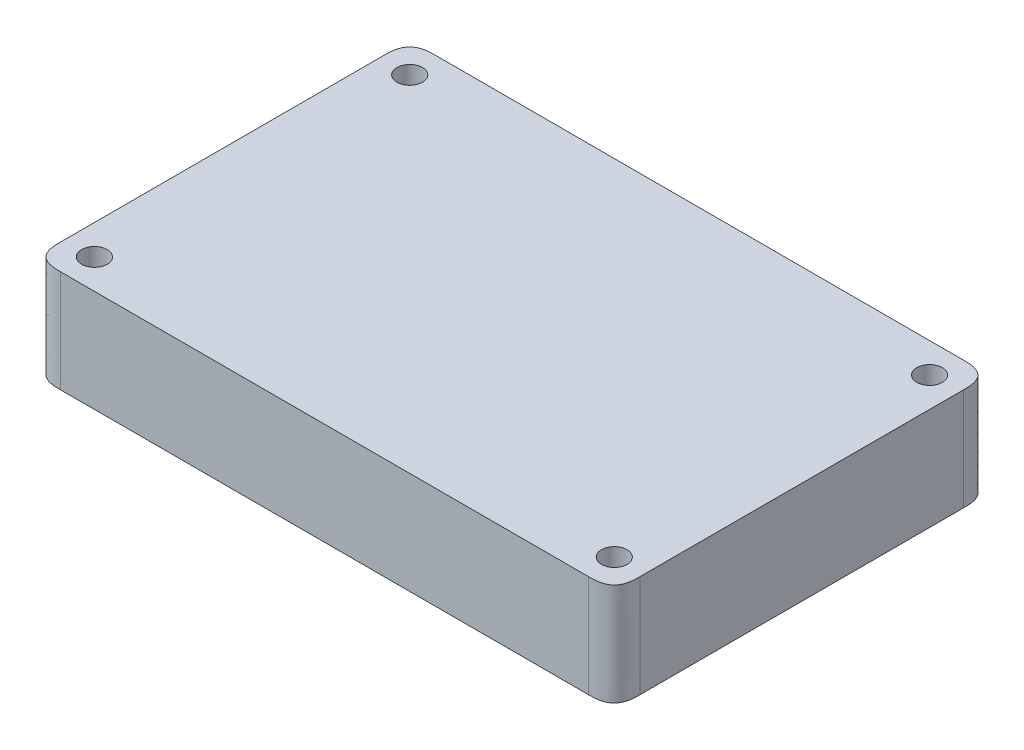
ISO-10303-21;
HEADER;
FILE_DESCRIPTION(('STEP AP214'),'2;1');
FILE_NAME('part.step','',(''),(''),'','','');
FILE_SCHEMA(('AUTOMOTIVE_DESIGN { 1 0 10303 214 1 1 1 1 }'));
ENDSEC;
DATA;
#1=APPLICATION_CONTEXT('core data for automotive mechanical design processes');
#2=APPLICATION_PROTOCOL_DEFINITION('international standard','automotive_design',2000,#1);
#3=PRODUCT_CONTEXT('',#1,'mechanical');
#4=PRODUCT('Part','Part','',(#3));
#5=PRODUCT_RELATED_PRODUCT_CATEGORY('part','',(#4));
#6=PRODUCT_DEFINITION_FORMATION('','',#4);
#7=PRODUCT_DEFINITION_CONTEXT('part definition',#1,'design');
#8=PRODUCT_DEFINITION('design','',#6,#7);
#9=PRODUCT_DEFINITION_SHAPE('','',#8);
#10=(LENGTH_UNIT() NAMED_UNIT(*) SI_UNIT(.MILLI.,.METRE.));
#11=(NAMED_UNIT(*) PLANE_ANGLE_UNIT() SI_UNIT($,.RADIAN.));
#12=(NAMED_UNIT(*) SI_UNIT($,.STERADIAN.) SOLID_ANGLE_UNIT());
#13=UNCERTAINTY_MEASURE_WITH_UNIT(LENGTH_MEASURE(1.E-05),#10,'distance_accuracy_value','');
#14=(GEOMETRIC_REPRESENTATION_CONTEXT(3) GLOBAL_UNCERTAINTY_ASSIGNED_CONTEXT((#13)) GLOBAL_UNIT_ASSIGNED_CONTEXT((#10,
#11,#12)) REPRESENTATION_CONTEXT('',''));
#15=CARTESIAN_POINT('',(0.,0.,0.));
#16=DIRECTION('',(0.,0.,1.));
#17=DIRECTION('',(1.,0.,0.));
#18=AXIS2_PLACEMENT_3D('',#15,#16,#17);
#19=CARTESIAN_POINT('',(0.,12.,0.));
#20=DIRECTION('',(0.,1.,0.));
#21=DIRECTION('',(0.,0.,1.));
#22=AXIS2_PLACEMENT_3D('',#19,#20,#21);
#23=PLANE('',#22);
#24=CARTESIAN_POINT('',(32.6417721518988,12.,-18.5));
#25=DIRECTION('',(0.,1.,0.));
#26=DIRECTION('',(0.,0.,1.));
#27=AXIS2_PLACEMENT_3D('',#24,#25,#26);
#28=CIRCLE('',#27,1.5);
#29=CARTESIAN_POINT('',(32.6417721518988,12.,-17.));
#30=VERTEX_POINT('',#29);
#31=EDGE_CURVE('E255',#30,#30,#28,.T.);
#32=ORIENTED_EDGE('',*,*,#31,.F.);
#33=EDGE_LOOP('',(#32));
#34=FACE_BOUND('',#33,.T.);
#35=CARTESIAN_POINT('',(-28.3582278481012,12.,18.5));
#36=DIRECTION('',(0.,1.,0.));
#37=DIRECTION('',(0.,0.,1.));
#38=AXIS2_PLACEMENT_3D('',#35,#36,#37);
#39=CIRCLE('',#38,1.5);
#40=CARTESIAN_POINT('',(-28.3582278481012,12.,20.));
#41=VERTEX_POINT('',#40);
#42=EDGE_CURVE('E148',#41,#41,#39,.T.);
#43=ORIENTED_EDGE('',*,*,#42,.F.);
#44=EDGE_LOOP('',(#43));
#45=FACE_BOUND('',#44,.T.);
#46=DIRECTION('',(-1.,0.,0.));
#47=VECTOR('',#46,1.);
#48=CARTESIAN_POINT('',(-31.8582278481012,12.,-22.));
#49=LINE('',#48,#47);
#50=CARTESIAN_POINT('',(33.1417721518988,12.,-22.));
#51=VERTEX_POINT('',#50);
#52=CARTESIAN_POINT('',(-28.8582278481012,12.,-22.));
#53=VERTEX_POINT('',#52);
#54=EDGE_CURVE('E211',#51,#53,#49,.T.);
#55=ORIENTED_EDGE('',*,*,#54,.T.);
#56=CARTESIAN_POINT('',(-31.8582278481012,12.,-19.));
#57=CARTESIAN_POINT('',(-31.8582278481012,12.,-19.5045941546018));
#58=CARTESIAN_POINT('',(-31.8582278481012,12.,-20.0091883092037));
#59=CARTESIAN_POINT('',(-31.643152088593,12.,-21.1213203435596));
#60=CARTESIAN_POINT('',(-30.9795481916609,12.,-21.7849242404917));
#61=CARTESIAN_POINT('',(-29.8674161573049,12.,-22.));
#62=CARTESIAN_POINT('',(-29.3628220027031,12.,-22.));
#63=CARTESIAN_POINT('',(-28.8582278481012,12.,-22.));
#64=B_SPLINE_CURVE_WITH_KNOTS('',5,(#56,#57,#58,#59,#60,#61,#62,#63),.UNSPECIFIED.,.F.,.F.,(6,2,
6),(0.,0.5,1.),.UNSPECIFIED.);
#65=CARTESIAN_POINT('',(-31.8582278481012,12.,-19.));
#66=VERTEX_POINT('',#65);
#67=EDGE_CURVE('E349',#53,#66,#64,.F.);
#68=ORIENTED_EDGE('',*,*,#67,.T.);
#69=DIRECTION('',(0.,0.,1.));
#70=VECTOR('',#69,1.);
#71=CARTESIAN_POINT('',(-31.8582278481012,12.,-22.));
#72=LINE('',#71,#70);
#73=CARTESIAN_POINT('',(-31.8582278481012,12.,19.));
#74=VERTEX_POINT('',#73);
#75=EDGE_CURVE('E137',#66,#74,#72,.T.);
#76=ORIENTED_EDGE('',*,*,#75,.T.);
#77=CARTESIAN_POINT('',(-28.8582278481012,12.,22.));
#78=CARTESIAN_POINT('',(-29.3628220027031,12.,22.));
#79=CARTESIAN_POINT('',(-29.8674161573049,12.,22.));
#80=CARTESIAN_POINT('',(-30.9795481916609,12.,21.7849242404918));
#81=CARTESIAN_POINT('',(-31.643152088593,12.,21.1213203435596));
#82=CARTESIAN_POINT('',(-31.8582278481012,12.,20.0091883092037));
#83=CARTESIAN_POINT('',(-31.8582278481012,12.,19.5045941546018));
#84=CARTESIAN_POINT('',(-31.8582278481012,12.,19.));
#85=B_SPLINE_CURVE_WITH_KNOTS('',5,(#77,#78,#79,#80,#81,#82,#83,#84),.UNSPECIFIED.,.F.,.F.,(6,2,
6),(0.,0.5,1.),.UNSPECIFIED.);
#86=CARTESIAN_POINT('',(-28.8582278481012,12.,22.));
#87=VERTEX_POINT('',#86);
#88=EDGE_CURVE('E346',#74,#87,#85,.F.);
#89=ORIENTED_EDGE('',*,*,#88,.T.);
#90=DIRECTION('',(1.,0.,0.));
#91=VECTOR('',#90,1.);
#92=CARTESIAN_POINT('',(-31.8582278481012,12.,22.));
#93=LINE('',#92,#91);
#94=CARTESIAN_POINT('',(33.1417721518988,12.,22.));
#95=VERTEX_POINT('',#94);
#96=EDGE_CURVE('E237',#87,#95,#93,.T.);
#97=ORIENTED_EDGE('',*,*,#96,.T.);
#98=CARTESIAN_POINT('',(36.1417721518988,12.,19.));
#99=CARTESIAN_POINT('',(36.1417721518988,12.,19.5045941546018));
#100=CARTESIAN_POINT('',(36.1417721518988,12.,20.0091883092037));
#101=CARTESIAN_POINT('',(35.9266963923905,12.,21.1213203435596));
#102=CARTESIAN_POINT('',(35.2630924954584,12.,21.7849242404917));
#103=CARTESIAN_POINT('',(34.1509604611024,12.,22.));
#104=CARTESIAN_POINT('',(33.6463663065006,12.,22.));
#105=CARTESIAN_POINT('',(33.1417721518988,12.,22.));
#106=B_SPLINE_CURVE_WITH_KNOTS('',5,(#98,#99,#100,#101,#102,#103,#104,#105),.UNSPECIFIED.,.F.,
.F.,(6,2,6),(0.,0.5,1.),.UNSPECIFIED.);
#107=CARTESIAN_POINT('',(36.1417721518988,12.,19.));
#108=VERTEX_POINT('',#107);
#109=EDGE_CURVE('E65',#95,#108,#106,.F.);
#110=ORIENTED_EDGE('',*,*,#109,.T.);
#111=DIRECTION('',(0.,0.,-1.));
#112=VECTOR('',#111,1.);
#113=CARTESIAN_POINT('',(36.1417721518988,12.,-22.));
#114=LINE('',#113,#112);
#115=CARTESIAN_POINT('',(36.1417721518988,12.,-19.));
#116=VERTEX_POINT('',#115);
#117=EDGE_CURVE('E219',#108,#116,#114,.T.);
#118=ORIENTED_EDGE('',*,*,#117,.T.);
#119=CARTESIAN_POINT('',(33.1417721518988,12.,-22.));
#120=CARTESIAN_POINT('',(33.6463663065006,12.,-22.));
#121=CARTESIAN_POINT('',(34.1509604611025,12.,-22.));
#122=CARTESIAN_POINT('',(35.2630924954584,12.,-21.7849242404918));
#123=CARTESIAN_POINT('',(35.9266963923905,12.,-21.1213203435596));
#124=CARTESIAN_POINT('',(36.1417721518988,12.,-20.0091883092037));
#125=CARTESIAN_POINT('',(36.1417721518988,12.,-19.5045941546018));
#126=CARTESIAN_POINT('',(36.1417721518988,12.,-19.));
#127=B_SPLINE_CURVE_WITH_KNOTS('',5,(#119,#120,#121,#122,#123,#124,#125,#126),.UNSPECIFIED.,.F.,
.F.,(6,2,6),(0.,0.5,1.),.UNSPECIFIED.);
#128=EDGE_CURVE('E355',#116,#51,#127,.F.);
#129=ORIENTED_EDGE('',*,*,#128,.T.);
#130=EDGE_LOOP('',(#55,#68,#76,#89,#97,#110,#118,#129));
#131=FACE_BOUND('',#130,.T.);
#132=CARTESIAN_POINT('',(32.6417721518988,12.,18.5));
#133=DIRECTION('',(0.,1.,0.));
#134=DIRECTION('',(0.,0.,-1.));
#135=AXIS2_PLACEMENT_3D('',#132,#133,#134);
#136=CIRCLE('',#135,1.5);
#137=CARTESIAN_POINT('',(32.6417721518988,12.,17.));
#138=VERTEX_POINT('',#137);
#139=EDGE_CURVE('E250',#138,#138,#136,.T.);
#140=ORIENTED_EDGE('',*,*,#139,.F.);
#141=EDGE_LOOP('',(#140));
#142=FACE_BOUND('',#141,.T.);
#143=CARTESIAN_POINT('',(-28.3582278481012,12.,-18.5));
#144=DIRECTION('',(0.,1.,0.));
#145=DIRECTION('',(0.,0.,-1.));
#146=AXIS2_PLACEMENT_3D('',#143,#144,#145);
#147=CIRCLE('',#146,1.5);
#148=CARTESIAN_POINT('',(-28.3582278481012,12.,-20.));
#149=VERTEX_POINT('',#148);
#150=EDGE_CURVE('E261',#149,#149,#147,.T.);
#151=ORIENTED_EDGE('',*,*,#150,.F.);
#152=EDGE_LOOP('',(#151));
#153=FACE_BOUND('',#152,.T.);
#154=ADVANCED_FACE('F36',(#34,#45,#131,#142,#153),#23,.T.);
#155=CARTESIAN_POINT('',(0.,0.,0.));
#156=DIRECTION('',(0.,1.,0.));
#157=DIRECTION('',(0.,0.,1.));
#158=AXIS2_PLACEMENT_3D('',#155,#156,#157);
#159=PLANE('',#158);
#160=DIRECTION('',(0.,0.,1.));
#161=VECTOR('',#160,1.);
#162=CARTESIAN_POINT('',(-31.8582278481012,0.,-22.));
#163=LINE('',#162,#161);
#164=CARTESIAN_POINT('',(-31.8582278481012,0.,-19.));
#165=VERTEX_POINT('',#164);
#166=CARTESIAN_POINT('',(-31.8582278481012,0.,19.));
#167=VERTEX_POINT('',#166);
#168=EDGE_CURVE('E134',#165,#167,#163,.T.);
#169=ORIENTED_EDGE('',*,*,#168,.F.);
#170=CARTESIAN_POINT('',(-28.8582278481012,0.,-22.));
#171=CARTESIAN_POINT('',(-29.3628220027031,0.,-22.));
#172=CARTESIAN_POINT('',(-29.8674161573049,0.,-22.));
#173=CARTESIAN_POINT('',(-30.9795481916609,0.,-21.7849242404917));
#174=CARTESIAN_POINT('',(-31.643152088593,0.,-21.1213203435596));
#175=CARTESIAN_POINT('',(-31.8582278481012,0.,-20.0091883092037));
#176=CARTESIAN_POINT('',(-31.8582278481012,0.,-19.5045941546018));
#177=CARTESIAN_POINT('',(-31.8582278481012,0.,-19.));
#178=B_SPLINE_CURVE_WITH_KNOTS('',5,(#170,#171,#172,#173,#174,#175,#176,#177),.UNSPECIFIED.,.F.,
.F.,(6,2,6),(0.,0.5,1.),.UNSPECIFIED.);
#179=CARTESIAN_POINT('',(-28.8582278481012,0.,-22.));
#180=VERTEX_POINT('',#179);
#181=EDGE_CURVE('E111',#165,#180,#178,.F.);
#182=ORIENTED_EDGE('',*,*,#181,.T.);
#183=DIRECTION('',(-1.,0.,0.));
#184=VECTOR('',#183,1.);
#185=CARTESIAN_POINT('',(-31.8582278481012,0.,-22.));
#186=LINE('',#185,#184);
#187=CARTESIAN_POINT('',(33.1417721518988,0.,-22.));
#188=VERTEX_POINT('',#187);
#189=EDGE_CURVE('E317',#188,#180,#186,.T.);
#190=ORIENTED_EDGE('',*,*,#189,.F.);
#191=CARTESIAN_POINT('',(36.1417721518988,0.,-19.));
#192=CARTESIAN_POINT('',(36.1417721518988,0.,-19.5045941546018));
#193=CARTESIAN_POINT('',(36.1417721518988,0.,-20.0091883092037));
#194=CARTESIAN_POINT('',(35.9266963923905,0.,-21.1213203435596));
#195=CARTESIAN_POINT('',(35.2630924954584,0.,-21.7849242404917));
#196=CARTESIAN_POINT('',(34.1509604611025,0.,-22.));
#197=CARTESIAN_POINT('',(33.6463663065006,0.,-22.));
#198=CARTESIAN_POINT('',(33.1417721518988,0.,-22.));
#199=B_SPLINE_CURVE_WITH_KNOTS('',5,(#191,#192,#193,#194,#195,#196,#197,#198),.UNSPECIFIED.,.F.,
.F.,(6,2,6),(0.,0.5,1.),.UNSPECIFIED.);
#200=CARTESIAN_POINT('',(36.1417721518988,0.,-19.));
#201=VERTEX_POINT('',#200);
#202=EDGE_CURVE('E126',#188,#201,#199,.F.);
#203=ORIENTED_EDGE('',*,*,#202,.T.);
#204=DIRECTION('',(0.,0.,-1.));
#205=VECTOR('',#204,1.);
#206=CARTESIAN_POINT('',(36.1417721518988,0.,-22.));
#207=LINE('',#206,#205);
#208=CARTESIAN_POINT('',(36.1417721518988,0.,19.));
#209=VERTEX_POINT('',#208);
#210=EDGE_CURVE('E151',#209,#201,#207,.T.);
#211=ORIENTED_EDGE('',*,*,#210,.F.);
#212=CARTESIAN_POINT('',(33.1417721518988,0.,22.));
#213=CARTESIAN_POINT('',(33.6463663065006,0.,22.));
#214=CARTESIAN_POINT('',(34.1509604611024,0.,22.));
#215=CARTESIAN_POINT('',(35.2630924954584,0.,21.7849242404917));
#216=CARTESIAN_POINT('',(35.9266963923905,0.,21.1213203435596));
#217=CARTESIAN_POINT('',(36.1417721518988,0.,20.0091883092037));
#218=CARTESIAN_POINT('',(36.1417721518988,0.,19.5045941546018));
#219=CARTESIAN_POINT('',(36.1417721518988,0.,19.));
#220=B_SPLINE_CURVE_WITH_KNOTS('',5,(#212,#213,#214,#215,#216,#217,#218,#219),.UNSPECIFIED.,.F.,
.F.,(6,2,6),(0.,0.5,1.),.UNSPECIFIED.);
#221=CARTESIAN_POINT('',(33.1417721518988,0.,22.));
#222=VERTEX_POINT('',#221);
#223=EDGE_CURVE('E138',#209,#222,#220,.F.);
#224=ORIENTED_EDGE('',*,*,#223,.T.);
#225=DIRECTION('',(1.,0.,0.));
#226=VECTOR('',#225,1.);
#227=CARTESIAN_POINT('',(-31.8582278481012,0.,22.));
#228=LINE('',#227,#226);
#229=CARTESIAN_POINT('',(-28.8582278481012,0.,22.));
#230=VERTEX_POINT('',#229);
#231=EDGE_CURVE('E147',#230,#222,#228,.T.);
#232=ORIENTED_EDGE('',*,*,#231,.F.);
#233=CARTESIAN_POINT('',(-31.8582278481012,0.,19.));
#234=CARTESIAN_POINT('',(-31.8582278481012,0.,19.5045941546018));
#235=CARTESIAN_POINT('',(-31.8582278481012,0.,20.0091883092037));
#236=CARTESIAN_POINT('',(-31.643152088593,0.,21.1213203435596));
#237=CARTESIAN_POINT('',(-30.9795481916609,0.,21.7849242404918));
#238=CARTESIAN_POINT('',(-29.8674161573049,0.,22.));
#239=CARTESIAN_POINT('',(-29.3628220027031,0.,22.));
#240=CARTESIAN_POINT('',(-28.8582278481012,0.,22.));
#241=B_SPLINE_CURVE_WITH_KNOTS('',5,(#233,#234,#235,#236,#237,#238,#239,#240),.UNSPECIFIED.,.F.,
.F.,(6,2,6),(0.,0.5,1.),.UNSPECIFIED.);
#242=EDGE_CURVE('E145',#230,#167,#241,.F.);
#243=ORIENTED_EDGE('',*,*,#242,.T.);
#244=EDGE_LOOP('',(#169,#182,#190,#203,#211,#224,#232,#243));
#245=FACE_BOUND('',#244,.T.);
#246=CARTESIAN_POINT('',(-28.3582278481012,0.,18.5));
#247=DIRECTION('',(0.,1.,0.));
#248=DIRECTION('',(0.,0.,1.));
#249=AXIS2_PLACEMENT_3D('',#246,#247,#248);
#250=CIRCLE('',#249,1.5);
#251=CARTESIAN_POINT('',(-28.3582278481012,0.,20.));
#252=VERTEX_POINT('',#251);
#253=EDGE_CURVE('E154',#252,#252,#250,.T.);
#254=ORIENTED_EDGE('',*,*,#253,.T.);
#255=EDGE_LOOP('',(#254));
#256=FACE_BOUND('',#255,.T.);
#257=CARTESIAN_POINT('',(32.6417721518988,0.,18.5));
#258=DIRECTION('',(0.,1.,0.));
#259=DIRECTION('',(0.,0.,-1.));
#260=AXIS2_PLACEMENT_3D('',#257,#258,#259);
#261=CIRCLE('',#260,1.5);
#262=CARTESIAN_POINT('',(32.6417721518988,0.,17.));
#263=VERTEX_POINT('',#262);
#264=EDGE_CURVE('E252',#263,#263,#261,.T.);
#265=ORIENTED_EDGE('',*,*,#264,.T.);
#266=EDGE_LOOP('',(#265));
#267=FACE_BOUND('',#266,.T.);
#268=CARTESIAN_POINT('',(32.6417721518988,0.,-18.5));
#269=DIRECTION('',(0.,1.,0.));
#270=DIRECTION('',(0.,0.,1.));
#271=AXIS2_PLACEMENT_3D('',#268,#269,#270);
#272=CIRCLE('',#271,1.5);
#273=CARTESIAN_POINT('',(32.6417721518988,0.,-17.));
#274=VERTEX_POINT('',#273);
#275=EDGE_CURVE('E258',#274,#274,#272,.T.);
#276=ORIENTED_EDGE('',*,*,#275,.T.);
#277=EDGE_LOOP('',(#276));
#278=FACE_BOUND('',#277,.T.);
#279=CARTESIAN_POINT('',(-28.3582278481012,0.,-18.5));
#280=DIRECTION('',(0.,1.,0.));
#281=DIRECTION('',(0.,0.,-1.));
#282=AXIS2_PLACEMENT_3D('',#279,#280,#281);
#283=CIRCLE('',#282,1.5);
#284=CARTESIAN_POINT('',(-28.3582278481012,0.,-20.));
#285=VERTEX_POINT('',#284);
#286=EDGE_CURVE('E264',#285,#285,#283,.T.);
#287=ORIENTED_EDGE('',*,*,#286,.T.);
#288=EDGE_LOOP('',(#287));
#289=FACE_BOUND('',#288,.T.);
#290=ADVANCED_FACE('F142',(#245,#256,#267,#278,#289),#159,.F.);
#291=CARTESIAN_POINT('',(-31.8582278481012,12.,-22.));
#292=DIRECTION('',(1.,0.,0.));
#293=DIRECTION('',(0.,0.,-1.));
#294=AXIS2_PLACEMENT_3D('',#291,#292,#293);
#295=PLANE('',#294);
#296=ORIENTED_EDGE('',*,*,#75,.F.);
#297=CARTESIAN_POINT('',(-31.8582278481012,-0.600000000000002,-19.));
#298=CARTESIAN_POINT('',(-31.8582278481012,3.8,-19.));
#299=CARTESIAN_POINT('',(-31.8582278481012,8.20000000000716,-19.));
#300=CARTESIAN_POINT('',(-31.8582278481012,12.6,-19.));
#301=B_SPLINE_CURVE_WITH_KNOTS('',3,(#297,#298,#299,#300),.UNSPECIFIED.,.F.,.F.,(4,4),(-0.0006,
0.0126),.UNSPECIFIED.);
#302=EDGE_CURVE('E116',#66,#165,#301,.F.);
#303=ORIENTED_EDGE('',*,*,#302,.T.);
#304=ORIENTED_EDGE('',*,*,#168,.T.);
#305=CARTESIAN_POINT('',(-31.8582278481012,12.6,19.));
#306=CARTESIAN_POINT('',(-31.8582278481012,8.20000000000716,19.));
#307=CARTESIAN_POINT('',(-31.8582278481012,3.8,19.));
#308=CARTESIAN_POINT('',(-31.8582278481012,-0.600000000000002,19.));
#309=B_SPLINE_CURVE_WITH_KNOTS('',3,(#305,#306,#307,#308),.UNSPECIFIED.,.F.,.F.,(4,4),(-0.0006,
0.0126),.UNSPECIFIED.);
#310=EDGE_CURVE('E139',#167,#74,#309,.F.);
#311=ORIENTED_EDGE('',*,*,#310,.T.);
#312=EDGE_LOOP('',(#296,#303,#304,#311));
#313=FACE_BOUND('',#312,.T.);
#314=ADVANCED_FACE('F133',(#313),#295,.F.);
#315=CARTESIAN_POINT('',(-31.8582278481012,12.,22.));
#316=DIRECTION('',(0.,0.,-1.));
#317=DIRECTION('',(-1.,0.,0.));
#318=AXIS2_PLACEMENT_3D('',#315,#316,#317);
#319=PLANE('',#318);
#320=ORIENTED_EDGE('',*,*,#96,.F.);
#321=CARTESIAN_POINT('',(-28.8582278481012,-0.600000000000002,22.));
#322=CARTESIAN_POINT('',(-28.8582278481012,3.8,22.));
#323=CARTESIAN_POINT('',(-28.8582278481012,8.20000000000716,22.));
#324=CARTESIAN_POINT('',(-28.8582278481012,12.6,22.));
#325=B_SPLINE_CURVE_WITH_KNOTS('',3,(#321,#322,#323,#324),.UNSPECIFIED.,.F.,.F.,(4,4),(-0.0006,
0.0126),.UNSPECIFIED.);
#326=EDGE_CURVE('E11',#87,#230,#325,.F.);
#327=ORIENTED_EDGE('',*,*,#326,.T.);
#328=ORIENTED_EDGE('',*,*,#231,.T.);
#329=CARTESIAN_POINT('',(33.1417721518988,12.6,22.));
#330=CARTESIAN_POINT('',(33.1417721518988,8.20000000000716,22.));
#331=CARTESIAN_POINT('',(33.1417721518988,3.8,22.));
#332=CARTESIAN_POINT('',(33.1417721518988,-0.600000000000002,22.));
#333=B_SPLINE_CURVE_WITH_KNOTS('',3,(#329,#330,#331,#332),.UNSPECIFIED.,.F.,.F.,(4,4),(-0.0006,
0.0126),.UNSPECIFIED.);
#334=EDGE_CURVE('E50',#222,#95,#333,.F.);
#335=ORIENTED_EDGE('',*,*,#334,.T.);
#336=EDGE_LOOP('',(#320,#327,#328,#335));
#337=FACE_BOUND('',#336,.T.);
#338=ADVANCED_FACE('F316',(#337),#319,.F.);
#339=CARTESIAN_POINT('',(36.1417721518988,12.,-22.));
#340=DIRECTION('',(-1.,0.,0.));
#341=DIRECTION('',(0.,0.,1.));
#342=AXIS2_PLACEMENT_3D('',#339,#340,#341);
#343=PLANE('',#342);
#344=ORIENTED_EDGE('',*,*,#210,.T.);
#345=CARTESIAN_POINT('',(36.1417721518988,12.6,-19.));
#346=CARTESIAN_POINT('',(36.1417721518988,8.20000000000716,-19.));
#347=CARTESIAN_POINT('',(36.1417721518988,3.8,-19.));
#348=CARTESIAN_POINT('',(36.1417721518988,-0.600000000000002,-19.));
#349=B_SPLINE_CURVE_WITH_KNOTS('',3,(#345,#346,#347,#348),.UNSPECIFIED.,.F.,.F.,(4,4),(-0.0006,
0.0126),.UNSPECIFIED.);
#350=EDGE_CURVE('E57',#201,#116,#349,.F.);
#351=ORIENTED_EDGE('',*,*,#350,.T.);
#352=ORIENTED_EDGE('',*,*,#117,.F.);
#353=CARTESIAN_POINT('',(36.1417721518988,-0.600000000000002,19.));
#354=CARTESIAN_POINT('',(36.1417721518988,3.8,19.));
#355=CARTESIAN_POINT('',(36.1417721518988,8.20000000000716,19.));
#356=CARTESIAN_POINT('',(36.1417721518988,12.6,19.));
#357=B_SPLINE_CURVE_WITH_KNOTS('',3,(#353,#354,#355,#356),.UNSPECIFIED.,.F.,.F.,(4,4),(-0.0006,
0.0126),.UNSPECIFIED.);
#358=EDGE_CURVE('E413',#108,#209,#357,.F.);
#359=ORIENTED_EDGE('',*,*,#358,.T.);
#360=EDGE_LOOP('',(#344,#351,#352,#359));
#361=FACE_BOUND('',#360,.T.);
#362=ADVANCED_FACE('F310',(#361),#343,.F.);
#363=CARTESIAN_POINT('',(-31.8582278481012,12.,-22.));
#364=DIRECTION('',(0.,0.,1.));
#365=DIRECTION('',(1.,0.,0.));
#366=AXIS2_PLACEMENT_3D('',#363,#364,#365);
#367=PLANE('',#366);
#368=ORIENTED_EDGE('',*,*,#189,.T.);
#369=CARTESIAN_POINT('',(-28.8582278481012,12.6,-22.));
#370=CARTESIAN_POINT('',(-28.8582278481012,8.20000000000716,-22.));
#371=CARTESIAN_POINT('',(-28.8582278481012,3.8,-22.));
#372=CARTESIAN_POINT('',(-28.8582278481012,-0.600000000000002,-22.));
#373=B_SPLINE_CURVE_WITH_KNOTS('',3,(#369,#370,#371,#372),.UNSPECIFIED.,.F.,.F.,(4,4),(-0.0006,
0.0126),.UNSPECIFIED.);
#374=EDGE_CURVE('E118',#180,#53,#373,.F.);
#375=ORIENTED_EDGE('',*,*,#374,.T.);
#376=ORIENTED_EDGE('',*,*,#54,.F.);
#377=CARTESIAN_POINT('',(33.1417721518988,-0.600000000000002,-22.));
#378=CARTESIAN_POINT('',(33.1417721518988,3.8,-22.));
#379=CARTESIAN_POINT('',(33.1417721518988,8.20000000000716,-22.));
#380=CARTESIAN_POINT('',(33.1417721518988,12.6,-22.));
#381=B_SPLINE_CURVE_WITH_KNOTS('',3,(#377,#378,#379,#380),.UNSPECIFIED.,.F.,.F.,(4,4),(-0.0006,
0.0126),.UNSPECIFIED.);
#382=EDGE_CURVE('E125',#51,#188,#381,.F.);
#383=ORIENTED_EDGE('',*,*,#382,.T.);
#384=EDGE_LOOP('',(#368,#375,#376,#383));
#385=FACE_BOUND('',#384,.T.);
#386=ADVANCED_FACE('F190',(#385),#367,.F.);
#387=CARTESIAN_POINT('',(-28.3582278481012,12.,18.5));
#388=DIRECTION('',(0.,-1.,0.));
#389=DIRECTION('',(0.,0.,-1.));
#390=AXIS2_PLACEMENT_3D('',#387,#388,#389);
#391=CYLINDRICAL_SURFACE('',#390,1.5);
#392=ORIENTED_EDGE('',*,*,#42,.T.);
#393=EDGE_LOOP('',(#392));
#394=FACE_BOUND('',#393,.T.);
#395=ORIENTED_EDGE('',*,*,#253,.F.);
#396=EDGE_LOOP('',(#395));
#397=FACE_BOUND('',#396,.T.);
#398=ADVANCED_FACE('F287',(#394,#397),#391,.F.);
#399=CARTESIAN_POINT('',(32.6417721518988,12.,18.5));
#400=DIRECTION('',(0.,-1.,0.));
#401=DIRECTION('',(0.,0.,-1.));
#402=AXIS2_PLACEMENT_3D('',#399,#400,#401);
#403=CYLINDRICAL_SURFACE('',#402,1.5);
#404=ORIENTED_EDGE('',*,*,#139,.T.);
#405=EDGE_LOOP('',(#404));
#406=FACE_BOUND('',#405,.T.);
#407=ORIENTED_EDGE('',*,*,#264,.F.);
#408=EDGE_LOOP('',(#407));
#409=FACE_BOUND('',#408,.T.);
#410=ADVANCED_FACE('F283',(#406,#409),#403,.F.);
#411=CARTESIAN_POINT('',(32.6417721518988,12.,-18.5));
#412=DIRECTION('',(0.,-1.,0.));
#413=DIRECTION('',(0.,0.,-1.));
#414=AXIS2_PLACEMENT_3D('',#411,#412,#413);
#415=CYLINDRICAL_SURFACE('',#414,1.5);
#416=ORIENTED_EDGE('',*,*,#31,.T.);
#417=EDGE_LOOP('',(#416));
#418=FACE_BOUND('',#417,.T.);
#419=ORIENTED_EDGE('',*,*,#275,.F.);
#420=EDGE_LOOP('',(#419));
#421=FACE_BOUND('',#420,.T.);
#422=ADVANCED_FACE('F286',(#418,#421),#415,.F.);
#423=CARTESIAN_POINT('',(-28.3582278481012,12.,-18.5));
#424=DIRECTION('',(0.,-1.,0.));
#425=DIRECTION('',(0.,0.,-1.));
#426=AXIS2_PLACEMENT_3D('',#423,#424,#425);
#427=CYLINDRICAL_SURFACE('',#426,1.5);
#428=ORIENTED_EDGE('',*,*,#150,.T.);
#429=EDGE_LOOP('',(#428));
#430=FACE_BOUND('',#429,.T.);
#431=ORIENTED_EDGE('',*,*,#286,.F.);
#432=EDGE_LOOP('',(#431));
#433=FACE_BOUND('',#432,.T.);
#434=ADVANCED_FACE('F270',(#430,#433),#427,.F.);
#435=CARTESIAN_POINT('',(-31.8582278481012,12.6,-19.));
#436=CARTESIAN_POINT('',(-31.8582278481012,8.20000000000716,-19.));
#437=CARTESIAN_POINT('',(-31.8582278481012,3.8,-19.));
#438=CARTESIAN_POINT('',(-31.8582278481012,-0.600000000000002,-19.));
#439=CARTESIAN_POINT('',(-31.8582278481012,12.6,-19.5045941546018));
#440=CARTESIAN_POINT('',(-31.8582278481012,8.20000000000716,-19.5045941546018));
#441=CARTESIAN_POINT('',(-31.8582278481012,3.8,-19.5045941546018));
#442=CARTESIAN_POINT('',(-31.8582278481012,-0.600000000000002,-19.5045941546018));
#443=CARTESIAN_POINT('',(-31.8582278481012,12.6,-20.0091883092037));
#444=CARTESIAN_POINT('',(-31.8582278481012,8.20000000000716,-20.0091883092037));
#445=CARTESIAN_POINT('',(-31.8582278481012,3.8,-20.0091883092037));
#446=CARTESIAN_POINT('',(-31.8582278481012,-0.600000000000002,-20.0091883092037));
#447=CARTESIAN_POINT('',(-31.643152088593,12.6,-21.1213203435596));
#448=CARTESIAN_POINT('',(-31.643152088593,8.20000000000716,-21.1213203435596));
#449=CARTESIAN_POINT('',(-31.643152088593,3.8,-21.1213203435596));
#450=CARTESIAN_POINT('',(-31.643152088593,-0.600000000000002,-21.1213203435596));
#451=CARTESIAN_POINT('',(-30.9795481916609,12.6,-21.7849242404917));
#452=CARTESIAN_POINT('',(-30.9795481916609,8.20000000000716,-21.7849242404918));
#453=CARTESIAN_POINT('',(-30.9795481916609,3.8,-21.7849242404918));
#454=CARTESIAN_POINT('',(-30.9795481916609,-0.600000000000002,-21.7849242404917));
#455=CARTESIAN_POINT('',(-29.8674161573049,12.6,-22.));
#456=CARTESIAN_POINT('',(-29.8674161573049,8.20000000000716,-22.));
#457=CARTESIAN_POINT('',(-29.8674161573049,3.8,-22.));
#458=CARTESIAN_POINT('',(-29.8674161573049,-0.600000000000002,-22.));
#459=CARTESIAN_POINT('',(-29.3628220027031,12.6,-22.));
#460=CARTESIAN_POINT('',(-29.3628220027031,8.20000000000716,-22.));
#461=CARTESIAN_POINT('',(-29.3628220027031,3.8,-22.));
#462=CARTESIAN_POINT('',(-29.3628220027031,-0.600000000000002,-22.));
#463=CARTESIAN_POINT('',(-28.8582278481012,12.6,-22.));
#464=CARTESIAN_POINT('',(-28.8582278481012,8.20000000000716,-22.));
#465=CARTESIAN_POINT('',(-28.8582278481012,3.8,-22.));
#466=CARTESIAN_POINT('',(-28.8582278481012,-0.600000000000002,-22.));
#467=B_SPLINE_SURFACE_WITH_KNOTS('',5,3,((#435,#436,#437,#438),(#439,#440,#441,#442),(#443,#444,
#445,#446),(#447,#448,#449,#450),(#451,#452,#453,#454),(#455,#456,#457,#458),(#459,#460,#461,
#462),(#463,#464,#465,#466)),.UNSPECIFIED.,.F.,.F.,.F.,(6,2,6),(4,4),(0.,0.5,1.),(-0.0006,
0.0126),.UNSPECIFIED.);
#468=ORIENTED_EDGE('',*,*,#67,.F.);
#469=ORIENTED_EDGE('',*,*,#374,.F.);
#470=ORIENTED_EDGE('',*,*,#181,.F.);
#471=ORIENTED_EDGE('',*,*,#302,.F.);
#472=EDGE_LOOP('',(#468,#469,#470,#471));
#473=FACE_BOUND('',#472,.T.);
#474=ADVANCED_FACE('F115',(#473),#467,.T.);
#475=CARTESIAN_POINT('',(33.1417721518988,12.6,-22.));
#476=CARTESIAN_POINT('',(33.1417721518988,8.20000000000716,-22.));
#477=CARTESIAN_POINT('',(33.1417721518988,3.8,-22.));
#478=CARTESIAN_POINT('',(33.1417721518988,-0.600000000000002,-22.));
#479=CARTESIAN_POINT('',(33.6463663065006,12.6,-22.));
#480=CARTESIAN_POINT('',(33.6463663065006,8.20000000000716,-22.));
#481=CARTESIAN_POINT('',(33.6463663065006,3.8,-22.));
#482=CARTESIAN_POINT('',(33.6463663065006,-0.600000000000002,-22.));
#483=CARTESIAN_POINT('',(34.1509604611025,12.6,-22.));
#484=CARTESIAN_POINT('',(34.1509604611025,8.20000000000716,-22.));
#485=CARTESIAN_POINT('',(34.1509604611025,3.8,-22.));
#486=CARTESIAN_POINT('',(34.1509604611025,-0.600000000000002,-22.));
#487=CARTESIAN_POINT('',(35.2630924954584,12.6,-21.7849242404917));
#488=CARTESIAN_POINT('',(35.2630924954584,8.20000000000716,-21.7849242404918));
#489=CARTESIAN_POINT('',(35.2630924954584,3.8,-21.7849242404918));
#490=CARTESIAN_POINT('',(35.2630924954584,-0.600000000000002,-21.7849242404917));
#491=CARTESIAN_POINT('',(35.9266963923905,12.6,-21.1213203435596));
#492=CARTESIAN_POINT('',(35.9266963923905,8.20000000000716,-21.1213203435596));
#493=CARTESIAN_POINT('',(35.9266963923905,3.8,-21.1213203435596));
#494=CARTESIAN_POINT('',(35.9266963923905,-0.600000000000002,-21.1213203435596));
#495=CARTESIAN_POINT('',(36.1417721518988,12.6,-20.0091883092037));
#496=CARTESIAN_POINT('',(36.1417721518988,8.20000000000716,-20.0091883092037));
#497=CARTESIAN_POINT('',(36.1417721518988,3.8,-20.0091883092037));
#498=CARTESIAN_POINT('',(36.1417721518988,-0.600000000000002,-20.0091883092037));
#499=CARTESIAN_POINT('',(36.1417721518988,12.6,-19.5045941546018));
#500=CARTESIAN_POINT('',(36.1417721518988,8.20000000000716,-19.5045941546018));
#501=CARTESIAN_POINT('',(36.1417721518988,3.8,-19.5045941546018));
#502=CARTESIAN_POINT('',(36.1417721518988,-0.600000000000002,-19.5045941546018));
#503=CARTESIAN_POINT('',(36.1417721518988,12.6,-19.));
#504=CARTESIAN_POINT('',(36.1417721518988,8.20000000000716,-19.));
#505=CARTESIAN_POINT('',(36.1417721518988,3.8,-19.));
#506=CARTESIAN_POINT('',(36.1417721518988,-0.600000000000002,-19.));
#507=B_SPLINE_SURFACE_WITH_KNOTS('',5,3,((#475,#476,#477,#478),(#479,#480,#481,#482),(#483,#484,
#485,#486),(#487,#488,#489,#490),(#491,#492,#493,#494),(#495,#496,#497,#498),(#499,#500,#501,
#502),(#503,#504,#505,#506)),.UNSPECIFIED.,.F.,.F.,.F.,(6,2,6),(4,4),(0.,0.5,1.),(-0.0006,
0.0126),.UNSPECIFIED.);
#508=ORIENTED_EDGE('',*,*,#128,.F.);
#509=ORIENTED_EDGE('',*,*,#350,.F.);
#510=ORIENTED_EDGE('',*,*,#202,.F.);
#511=ORIENTED_EDGE('',*,*,#382,.F.);
#512=EDGE_LOOP('',(#508,#509,#510,#511));
#513=FACE_BOUND('',#512,.T.);
#514=ADVANCED_FACE('F301',(#513),#507,.T.);
#515=CARTESIAN_POINT('',(-28.8582278481012,12.6,22.));
#516=CARTESIAN_POINT('',(-28.8582278481012,8.20000000000716,22.));
#517=CARTESIAN_POINT('',(-28.8582278481012,3.8,22.));
#518=CARTESIAN_POINT('',(-28.8582278481012,-0.600000000000002,22.));
#519=CARTESIAN_POINT('',(-29.3628220027031,12.6,22.));
#520=CARTESIAN_POINT('',(-29.3628220027031,8.20000000000716,22.));
#521=CARTESIAN_POINT('',(-29.3628220027031,3.8,22.));
#522=CARTESIAN_POINT('',(-29.3628220027031,-0.600000000000002,22.));
#523=CARTESIAN_POINT('',(-29.8674161573049,12.6,22.));
#524=CARTESIAN_POINT('',(-29.8674161573049,8.20000000000716,22.));
#525=CARTESIAN_POINT('',(-29.8674161573049,3.8,22.));
#526=CARTESIAN_POINT('',(-29.8674161573049,-0.600000000000002,22.));
#527=CARTESIAN_POINT('',(-30.9795481916609,12.6,21.7849242404918));
#528=CARTESIAN_POINT('',(-30.9795481916609,8.20000000000716,21.7849242404918));
#529=CARTESIAN_POINT('',(-30.9795481916609,3.8,21.7849242404918));
#530=CARTESIAN_POINT('',(-30.9795481916609,-0.600000000000002,21.7849242404918));
#531=CARTESIAN_POINT('',(-31.643152088593,12.6,21.1213203435596));
#532=CARTESIAN_POINT('',(-31.643152088593,8.20000000000716,21.1213203435596));
#533=CARTESIAN_POINT('',(-31.643152088593,3.8,21.1213203435596));
#534=CARTESIAN_POINT('',(-31.643152088593,-0.600000000000002,21.1213203435596));
#535=CARTESIAN_POINT('',(-31.8582278481012,12.6,20.0091883092037));
#536=CARTESIAN_POINT('',(-31.8582278481012,8.20000000000716,20.0091883092037));
#537=CARTESIAN_POINT('',(-31.8582278481012,3.8,20.0091883092037));
#538=CARTESIAN_POINT('',(-31.8582278481012,-0.600000000000002,20.0091883092037));
#539=CARTESIAN_POINT('',(-31.8582278481012,12.6,19.5045941546018));
#540=CARTESIAN_POINT('',(-31.8582278481012,8.20000000000716,19.5045941546018));
#541=CARTESIAN_POINT('',(-31.8582278481012,3.8,19.5045941546018));
#542=CARTESIAN_POINT('',(-31.8582278481012,-0.600000000000002,19.5045941546018));
#543=CARTESIAN_POINT('',(-31.8582278481012,12.6,19.));
#544=CARTESIAN_POINT('',(-31.8582278481012,8.20000000000716,19.));
#545=CARTESIAN_POINT('',(-31.8582278481012,3.8,19.));
#546=CARTESIAN_POINT('',(-31.8582278481012,-0.600000000000002,19.));
#547=B_SPLINE_SURFACE_WITH_KNOTS('',5,3,((#515,#516,#517,#518),(#519,#520,#521,#522),(#523,#524,
#525,#526),(#527,#528,#529,#530),(#531,#532,#533,#534),(#535,#536,#537,#538),(#539,#540,#541,
#542),(#543,#544,#545,#546)),.UNSPECIFIED.,.F.,.F.,.F.,(6,2,6),(4,4),(0.,0.5,1.),(-0.0006,
0.0126),.UNSPECIFIED.);
#548=ORIENTED_EDGE('',*,*,#88,.F.);
#549=ORIENTED_EDGE('',*,*,#310,.F.);
#550=ORIENTED_EDGE('',*,*,#242,.F.);
#551=ORIENTED_EDGE('',*,*,#326,.F.);
#552=EDGE_LOOP('',(#548,#549,#550,#551));
#553=FACE_BOUND('',#552,.T.);
#554=ADVANCED_FACE('F353',(#553),#547,.T.);
#555=CARTESIAN_POINT('',(36.1417721518988,12.6,19.));
#556=CARTESIAN_POINT('',(36.1417721518988,8.20000000000716,19.));
#557=CARTESIAN_POINT('',(36.1417721518988,3.8,19.));
#558=CARTESIAN_POINT('',(36.1417721518988,-0.600000000000002,19.));
#559=CARTESIAN_POINT('',(36.1417721518988,12.6,19.5045941546018));
#560=CARTESIAN_POINT('',(36.1417721518988,8.20000000000716,19.5045941546018));
#561=CARTESIAN_POINT('',(36.1417721518988,3.8,19.5045941546018));
#562=CARTESIAN_POINT('',(36.1417721518988,-0.600000000000002,19.5045941546018));
#563=CARTESIAN_POINT('',(36.1417721518988,12.6,20.0091883092037));
#564=CARTESIAN_POINT('',(36.1417721518988,8.20000000000716,20.0091883092037));
#565=CARTESIAN_POINT('',(36.1417721518988,3.8,20.0091883092037));
#566=CARTESIAN_POINT('',(36.1417721518988,-0.600000000000002,20.0091883092037));
#567=CARTESIAN_POINT('',(35.9266963923905,12.6,21.1213203435596));
#568=CARTESIAN_POINT('',(35.9266963923905,8.20000000000716,21.1213203435596));
#569=CARTESIAN_POINT('',(35.9266963923905,3.8,21.1213203435596));
#570=CARTESIAN_POINT('',(35.9266963923905,-0.600000000000002,21.1213203435596));
#571=CARTESIAN_POINT('',(35.2630924954584,12.6,21.7849242404917));
#572=CARTESIAN_POINT('',(35.2630924954584,8.20000000000716,21.7849242404918));
#573=CARTESIAN_POINT('',(35.2630924954584,3.8,21.7849242404918));
#574=CARTESIAN_POINT('',(35.2630924954584,-0.600000000000002,21.7849242404917));
#575=CARTESIAN_POINT('',(34.1509604611024,12.6,22.));
#576=CARTESIAN_POINT('',(34.1509604611024,8.20000000000716,22.));
#577=CARTESIAN_POINT('',(34.1509604611024,3.8,22.));
#578=CARTESIAN_POINT('',(34.1509604611024,-0.600000000000002,22.));
#579=CARTESIAN_POINT('',(33.6463663065006,12.6,22.));
#580=CARTESIAN_POINT('',(33.6463663065006,8.20000000000716,22.));
#581=CARTESIAN_POINT('',(33.6463663065006,3.8,22.));
#582=CARTESIAN_POINT('',(33.6463663065006,-0.600000000000002,22.));
#583=CARTESIAN_POINT('',(33.1417721518988,12.6,22.));
#584=CARTESIAN_POINT('',(33.1417721518988,8.20000000000716,22.));
#585=CARTESIAN_POINT('',(33.1417721518988,3.8,22.));
#586=CARTESIAN_POINT('',(33.1417721518988,-0.600000000000002,22.));
#587=B_SPLINE_SURFACE_WITH_KNOTS('',5,3,((#555,#556,#557,#558),(#559,#560,#561,#562),(#563,#564,
#565,#566),(#567,#568,#569,#570),(#571,#572,#573,#574),(#575,#576,#577,#578),(#579,#580,#581,
#582),(#583,#584,#585,#586)),.UNSPECIFIED.,.F.,.F.,.F.,(6,2,6),(4,4),(0.,0.5,1.),(-0.0006,
0.0126),.UNSPECIFIED.);
#588=ORIENTED_EDGE('',*,*,#109,.F.);
#589=ORIENTED_EDGE('',*,*,#334,.F.);
#590=ORIENTED_EDGE('',*,*,#223,.F.);
#591=ORIENTED_EDGE('',*,*,#358,.F.);
#592=EDGE_LOOP('',(#588,#589,#590,#591));
#593=FACE_BOUND('',#592,.T.);
#594=ADVANCED_FACE('F39',(#593),#587,.T.);
#595=CLOSED_SHELL('',(#154,#290,#314,#338,#362,#386,#398,#410,#422,#434,#474,#514,#554,#594));
#596=MANIFOLD_SOLID_BREP('B2',#595);
#597=ADVANCED_BREP_SHAPE_REPRESENTATION('',(#18,#596),#14);
#598=SHAPE_DEFINITION_REPRESENTATION(#9,#597);
ENDSEC;
END-ISO-10303-21;
